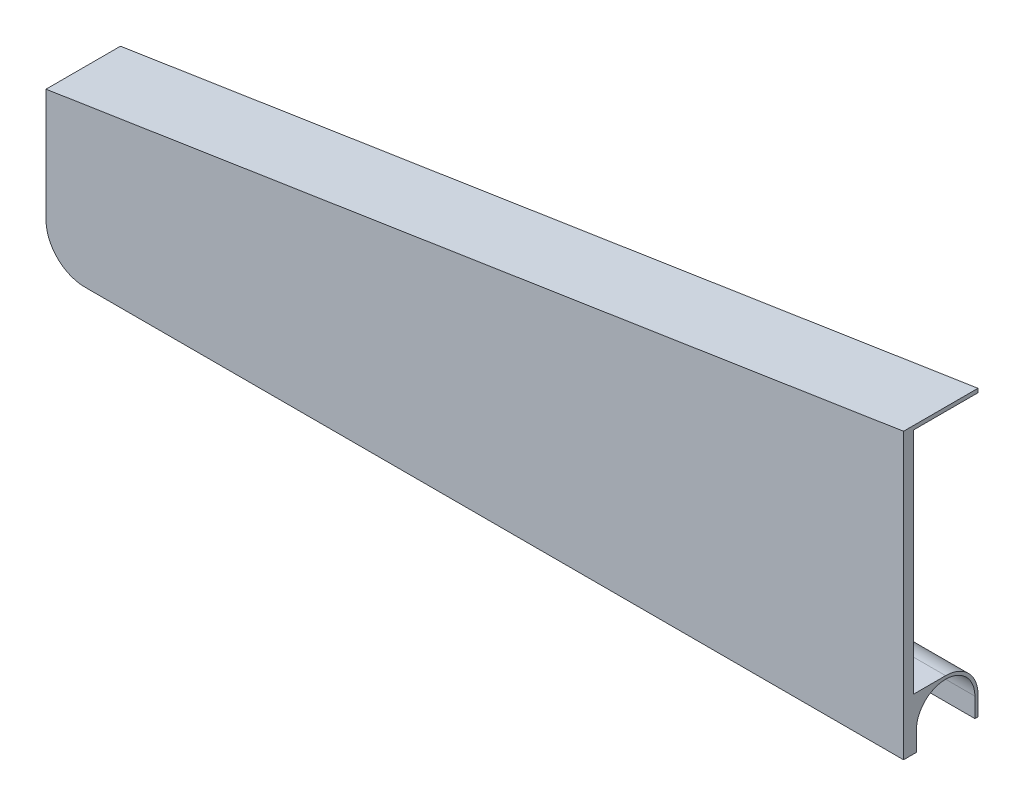
ISO-10303-21;
HEADER;
FILE_DESCRIPTION(('STEP AP214'),'2;1');
FILE_NAME('part.step','',(''),(''),'','','');
FILE_SCHEMA(('AUTOMOTIVE_DESIGN { 1 0 10303 214 1 1 1 1 }'));
ENDSEC;
DATA;
#1=APPLICATION_CONTEXT('core data for automotive mechanical design processes');
#2=APPLICATION_PROTOCOL_DEFINITION('international standard','automotive_design',2000,#1);
#3=PRODUCT_CONTEXT('',#1,'mechanical');
#4=PRODUCT('Part','Part','',(#3));
#5=PRODUCT_RELATED_PRODUCT_CATEGORY('part','',(#4));
#6=PRODUCT_DEFINITION_FORMATION('','',#4);
#7=PRODUCT_DEFINITION_CONTEXT('part definition',#1,'design');
#8=PRODUCT_DEFINITION('design','',#6,#7);
#9=PRODUCT_DEFINITION_SHAPE('','',#8);
#10=(LENGTH_UNIT() NAMED_UNIT(*) SI_UNIT(.MILLI.,.METRE.));
#11=(NAMED_UNIT(*) PLANE_ANGLE_UNIT() SI_UNIT($,.RADIAN.));
#12=(NAMED_UNIT(*) SI_UNIT($,.STERADIAN.) SOLID_ANGLE_UNIT());
#13=UNCERTAINTY_MEASURE_WITH_UNIT(LENGTH_MEASURE(1.E-05),#10,'distance_accuracy_value','');
#14=(GEOMETRIC_REPRESENTATION_CONTEXT(3) GLOBAL_UNCERTAINTY_ASSIGNED_CONTEXT((#13)) GLOBAL_UNIT_ASSIGNED_CONTEXT((#10,
#11,#12)) REPRESENTATION_CONTEXT('',''));
#15=CARTESIAN_POINT('',(0.,0.,0.));
#16=DIRECTION('',(0.,0.,1.));
#17=DIRECTION('',(1.,0.,0.));
#18=AXIS2_PLACEMENT_3D('',#15,#16,#17);
#19=CARTESIAN_POINT('',(0.,0.,0.));
#20=DIRECTION('',(0.,0.,1.));
#21=DIRECTION('',(1.,0.,0.));
#22=AXIS2_PLACEMENT_3D('',#19,#20,#21);
#23=PLANE('',#22);
#24=DIRECTION('',(-0.988267602905192,-0.15273226590353,0.));
#25=VECTOR('',#24,1.);
#26=CARTESIAN_POINT('',(50.7148891217656,-23.9579456620378,0.));
#27=LINE('',#26,#25);
#28=CARTESIAN_POINT('',(50.7148891217656,-23.9579456620378,0.));
#29=VERTEX_POINT('',#28);
#30=CARTESIAN_POINT('',(-508.085110878234,-110.317945662038,0.));
#31=VERTEX_POINT('',#30);
#32=EDGE_CURVE('E193',#29,#31,#27,.T.);
#33=ORIENTED_EDGE('',*,*,#32,.F.);
#34=DIRECTION('',(0.,-1.,0.));
#35=VECTOR('',#34,1.);
#36=CARTESIAN_POINT('',(50.7148891217656,0.,0.));
#37=LINE('',#36,#35);
#38=CARTESIAN_POINT('',(50.7148891217656,-173.055945662038,0.));
#39=VERTEX_POINT('',#38);
#40=EDGE_CURVE('E198',#29,#39,#37,.T.);
#41=ORIENTED_EDGE('',*,*,#40,.T.);
#42=DIRECTION('',(1.,0.,0.));
#43=VECTOR('',#42,1.);
#44=CARTESIAN_POINT('',(-508.085110878234,-173.055945662038,0.));
#45=LINE('',#44,#43);
#46=CARTESIAN_POINT('',(-508.085110878234,-173.055945662038,0.));
#47=VERTEX_POINT('',#46);
#48=EDGE_CURVE('E345',#47,#39,#45,.T.);
#49=ORIENTED_EDGE('',*,*,#48,.F.);
#50=DIRECTION('',(0.,-1.,0.));
#51=VECTOR('',#50,1.);
#52=CARTESIAN_POINT('',(-508.085110878234,0.,0.));
#53=LINE('',#52,#51);
#54=EDGE_CURVE('E343',#31,#47,#53,.T.);
#55=ORIENTED_EDGE('',*,*,#54,.F.);
#56=EDGE_LOOP('',(#33,#41,#49,#55));
#57=FACE_BOUND('',#56,.T.);
#58=ADVANCED_FACE('F68',(#57),#23,.F.);
#59=CARTESIAN_POINT('',(-508.085110878234,0.,6.35));
#60=DIRECTION('',(1.,0.,0.));
#61=DIRECTION('',(0.,0.,-1.));
#62=AXIS2_PLACEMENT_3D('',#59,#60,#61);
#63=PLANE('',#62);
#64=DIRECTION('',(0.,-1.,0.));
#65=VECTOR('',#64,1.);
#66=CARTESIAN_POINT('',(-508.085110878234,0.,6.35));
#67=LINE('',#66,#65);
#68=CARTESIAN_POINT('',(-508.085110878235,-107.777945662038,6.35));
#69=VERTEX_POINT('',#68);
#70=CARTESIAN_POINT('',(-508.085110878234,-181.437945662038,6.35));
#71=VERTEX_POINT('',#70);
#72=EDGE_CURVE('E334',#69,#71,#67,.T.);
#73=ORIENTED_EDGE('',*,*,#72,.F.);
#74=DIRECTION('',(0.,0.,-1.));
#75=VECTOR('',#74,1.);
#76=CARTESIAN_POINT('',(-508.085110878235,-107.777945662038,93.726));
#77=LINE('',#76,#75);
#78=CARTESIAN_POINT('',(-508.085110878234,-107.777945662038,-42.164));
#79=VERTEX_POINT('',#78);
#80=EDGE_CURVE('E82',#69,#79,#77,.T.);
#81=ORIENTED_EDGE('',*,*,#80,.T.);
#82=DIRECTION('',(0.,1.,0.));
#83=VECTOR('',#82,1.);
#84=CARTESIAN_POINT('',(-508.085110878234,-107.777945662038,-42.164));
#85=LINE('',#84,#83);
#86=CARTESIAN_POINT('',(-508.085110878234,-110.317945662038,-42.164));
#87=VERTEX_POINT('',#86);
#88=EDGE_CURVE('E184',#87,#79,#85,.T.);
#89=ORIENTED_EDGE('',*,*,#88,.F.);
#90=DIRECTION('',(0.,0.,1.));
#91=VECTOR('',#90,1.);
#92=CARTESIAN_POINT('',(-508.085110878234,-110.317945662038,-42.164));
#93=LINE('',#92,#91);
#94=EDGE_CURVE('E180',#87,#31,#93,.T.);
#95=ORIENTED_EDGE('',*,*,#94,.T.);
#96=ORIENTED_EDGE('',*,*,#54,.T.);
#97=DIRECTION('',(0.,0.,1.));
#98=VECTOR('',#97,1.);
#99=CARTESIAN_POINT('',(-508.085110878234,-173.055945662038,0.));
#100=LINE('',#99,#98);
#101=CARTESIAN_POINT('',(-508.085110878234,-173.055945662038,-21.082));
#102=VERTEX_POINT('',#101);
#103=EDGE_CURVE('E250',#102,#47,#100,.T.);
#104=ORIENTED_EDGE('',*,*,#103,.F.);
#105=CARTESIAN_POINT('',(-508.085110878234,-194.137945662038,-21.082));
#106=DIRECTION('',(-1.,0.,0.));
#107=DIRECTION('',(0.,-1.,0.));
#108=AXIS2_PLACEMENT_3D('',#105,#106,#107);
#109=CIRCLE('',#108,21.082);
#110=CARTESIAN_POINT('',(-508.085110878234,-181.437945662038,-37.9093801882527));
#111=VERTEX_POINT('',#110);
#112=EDGE_CURVE('E301',#102,#111,#109,.T.);
#113=ORIENTED_EDGE('',*,*,#112,.T.);
#114=DIRECTION('',(0.,0.,1.));
#115=VECTOR('',#114,1.);
#116=CARTESIAN_POINT('',(-508.085110878234,-181.437945662038,-93.726));
#117=LINE('',#116,#115);
#118=CARTESIAN_POINT('',(-508.085110878234,-181.437945662038,-35.2810316571236));
#119=VERTEX_POINT('',#118);
#120=EDGE_CURVE('E205',#111,#119,#117,.T.);
#121=ORIENTED_EDGE('',*,*,#120,.T.);
#122=CARTESIAN_POINT('',(-508.085110878234,-194.137945662038,-21.082));
#123=DIRECTION('',(-1.,0.,0.));
#124=DIRECTION('',(0.,-1.,0.));
#125=AXIS2_PLACEMENT_3D('',#122,#123,#124);
#126=CIRCLE('',#125,19.05);
#127=CARTESIAN_POINT('',(-508.085110878234,-181.437945662038,-6.8829683428764));
#128=VERTEX_POINT('',#127);
#129=EDGE_CURVE('E296',#128,#119,#126,.T.);
#130=ORIENTED_EDGE('',*,*,#129,.F.);
#131=DIRECTION('',(0.,0.,-1.));
#132=VECTOR('',#131,1.);
#133=CARTESIAN_POINT('',(-508.085110878234,-181.437945662038,6.35));
#134=LINE('',#133,#132);
#135=EDGE_CURVE('E282',#71,#128,#134,.T.);
#136=ORIENTED_EDGE('',*,*,#135,.F.);
#137=EDGE_LOOP('',(#73,#81,#89,#95,#96,#104,#113,#121,#130,#136));
#138=FACE_BOUND('',#137,.T.);
#139=ADVANCED_FACE('F70',(#138),#63,.F.);
#140=CARTESIAN_POINT('',(-508.085110878234,-206.837945662038,-40.132));
#141=DIRECTION('',(0.,-1.,0.));
#142=DIRECTION('',(1.,0.,0.));
#143=AXIS2_PLACEMENT_3D('',#140,#141,#142);
#144=PLANE('',#143);
#145=DIRECTION('',(1.,0.,0.));
#146=VECTOR('',#145,1.);
#147=CARTESIAN_POINT('',(-508.085110878234,-206.837945662038,-40.132));
#148=LINE('',#147,#146);
#149=CARTESIAN_POINT('',(-482.685110878234,-206.837945662038,-40.132));
#150=VERTEX_POINT('',#149);
#151=CARTESIAN_POINT('',(50.7148891217656,-206.837945662038,-40.132));
#152=VERTEX_POINT('',#151);
#153=EDGE_CURVE('E327',#150,#152,#148,.T.);
#154=ORIENTED_EDGE('',*,*,#153,.F.);
#155=DIRECTION('',(0.,0.,1.));
#156=VECTOR('',#155,1.);
#157=CARTESIAN_POINT('',(-482.685110878234,-206.837945662038,-93.726));
#158=LINE('',#157,#156);
#159=CARTESIAN_POINT('',(-482.685110878234,-206.837945662038,-42.164));
#160=VERTEX_POINT('',#159);
#161=EDGE_CURVE('E200',#160,#150,#158,.T.);
#162=ORIENTED_EDGE('',*,*,#161,.F.);
#163=DIRECTION('',(1.,0.,0.));
#164=VECTOR('',#163,1.);
#165=CARTESIAN_POINT('',(-508.085110878234,-206.837945662038,-42.164));
#166=LINE('',#165,#164);
#167=CARTESIAN_POINT('',(50.7148891217656,-206.837945662038,-42.164));
#168=VERTEX_POINT('',#167);
#169=EDGE_CURVE('E329',#160,#168,#166,.T.);
#170=ORIENTED_EDGE('',*,*,#169,.T.);
#171=DIRECTION('',(0.,0.,-1.));
#172=VECTOR('',#171,1.);
#173=CARTESIAN_POINT('',(50.7148891217656,-206.837945662038,-40.132));
#174=LINE('',#173,#172);
#175=EDGE_CURVE('E313',#152,#168,#174,.T.);
#176=ORIENTED_EDGE('',*,*,#175,.F.);
#177=EDGE_LOOP('',(#154,#162,#170,#176));
#178=FACE_BOUND('',#177,.T.);
#179=ADVANCED_FACE('F274',(#178),#144,.T.);
#180=CARTESIAN_POINT('',(-482.685110878234,-181.437945662038,6.35));
#181=DIRECTION('',(0.,0.,-1.));
#182=DIRECTION('',(-1.,0.,0.));
#183=AXIS2_PLACEMENT_3D('',#180,#181,#182);
#184=CYLINDRICAL_SURFACE('',#183,25.4);
#185=ORIENTED_EDGE('',*,*,#135,.T.);
#186=CARTESIAN_POINT('',(-508.085110878234,-181.437945662038,-6.8829683428764));
#187=CARTESIAN_POINT('',(-508.085110853028,-181.60945252099,-6.72956719004997));
#188=CARTESIAN_POINT('',(-508.083373348191,-181.783723997483,-6.5792892611043));
#189=CARTESIAN_POINT('',(-508.076090964915,-182.137557457659,-6.28517186652555));
#190=CARTESIAN_POINT('',(-508.070545855066,-182.317119762261,-6.14133279278495));
#191=CARTESIAN_POINT('',(-508.047697829708,-182.863422146816,-5.71973595761478));
#192=CARTESIAN_POINT('',(-508.024181965592,-183.237712354122,-5.45195701163423));
#193=CARTESIAN_POINT('',(-507.958184168992,-184.002905967128,-4.94527906713364));
#194=CARTESIAN_POINT('',(-507.915731173468,-184.393783205462,-4.70633670986128));
#195=CARTESIAN_POINT('',(-507.809738556414,-185.189492229823,-4.25832427173176));
#196=CARTESIAN_POINT('',(-507.746202856225,-185.594321408278,-4.04924864605675));
#197=CARTESIAN_POINT('',(-507.596050115694,-186.415906139081,-3.66133084835671));
#198=CARTESIAN_POINT('',(-507.509350866137,-186.832699355812,-3.48260014194911));
#199=CARTESIAN_POINT('',(-507.31174018432,-187.67296092858,-3.15689089425396));
#200=CARTESIAN_POINT('',(-507.200825966186,-188.096430047457,-3.0099160102702));
#201=CARTESIAN_POINT('',(-506.954221881208,-188.945644371535,-2.74788454658425));
#202=CARTESIAN_POINT('',(-506.818551018047,-189.371387589415,-2.63280365393837));
#203=CARTESIAN_POINT('',(-506.522369820378,-190.221322496853,-2.43386000573012));
#204=CARTESIAN_POINT('',(-506.361865963714,-190.645514561583,-2.34998912821004));
#205=CARTESIAN_POINT('',(-505.97435007336,-191.591354382813,-2.19551981212751));
#206=CARTESIAN_POINT('',(-505.740653370124,-192.111643085528,-2.13309542331459));
#207=CARTESIAN_POINT('',(-505.36334297739,-192.880826831807,-2.07178099981974));
#208=CARTESIAN_POINT('',(-505.233166744518,-193.135251560675,-2.05672947116737));
#209=CARTESIAN_POINT('',(-504.964118338946,-193.639894845376,-2.03683889631536));
#210=CARTESIAN_POINT('',(-504.825245525546,-193.890113089577,-2.03200060346716));
#211=CARTESIAN_POINT('',(-504.682156134359,-194.137945662038,-2.032));
#212=B_SPLINE_CURVE_WITH_KNOTS('',3,(#186,#187,#188,#189,#190,#191,#192,#193,#194,#195,#196,
#197,#198,#199,#200,#201,#202,#203,#204,#205,#206,#207,#208,#209,#210,#211),.UNSPECIFIED.,.F.,
.F.,(4,2,2,2,2,2,2,2,2,2,2,2,4),(0.,0.690212979654413,1.38046791125708,2.76123998176141,
4.13990934730638,5.51832242658451,6.90169412584391,8.28522506257535,9.66769840772433,
11.0498117320456,12.7676853661981,13.6259672320179,14.4843124044433),.UNSPECIFIED.);
#213=CARTESIAN_POINT('',(-504.682156134359,-194.137945662038,-2.03199999999999));
#214=VERTEX_POINT('',#213);
#215=EDGE_CURVE('E208',#128,#214,#212,.T.);
#216=ORIENTED_EDGE('',*,*,#215,.T.);
#217=CARTESIAN_POINT('',(-482.685110878234,-181.437945662038,-2.03199999999999));
#218=DIRECTION('',(0.,0.,-1.));
#219=DIRECTION('',(0.,1.,0.));
#220=AXIS2_PLACEMENT_3D('',#217,#218,#219);
#221=CIRCLE('',#220,25.4);
#222=CARTESIAN_POINT('',(-482.685110878234,-206.837945662038,-2.03199999999999));
#223=VERTEX_POINT('',#222);
#224=EDGE_CURVE('E76',#214,#223,#221,.F.);
#225=ORIENTED_EDGE('',*,*,#224,.T.);
#226=DIRECTION('',(0.,0.,-1.));
#227=VECTOR('',#226,1.);
#228=CARTESIAN_POINT('',(-482.685110878234,-206.837945662038,6.35));
#229=LINE('',#228,#227);
#230=CARTESIAN_POINT('',(-482.685110878234,-206.837945662038,6.35));
#231=VERTEX_POINT('',#230);
#232=EDGE_CURVE('E291',#231,#223,#229,.T.);
#233=ORIENTED_EDGE('',*,*,#232,.F.);
#234=CARTESIAN_POINT('',(-482.685110878234,-181.437945662038,6.35));
#235=DIRECTION('',(0.,0.,1.));
#236=DIRECTION('',(1.,0.,0.));
#237=AXIS2_PLACEMENT_3D('',#234,#235,#236);
#238=CIRCLE('',#237,25.4);
#239=EDGE_CURVE('E287',#231,#71,#238,.F.);
#240=ORIENTED_EDGE('',*,*,#239,.T.);
#241=EDGE_LOOP('',(#185,#216,#225,#233,#240));
#242=FACE_BOUND('',#241,.T.);
#243=ADVANCED_FACE('F271',(#242),#184,.T.);
#244=CARTESIAN_POINT('',(0.,-206.837945662038,6.35));
#245=DIRECTION('',(0.,1.,0.));
#246=DIRECTION('',(-1.,0.,0.));
#247=AXIS2_PLACEMENT_3D('',#244,#245,#246);
#248=PLANE('',#247);
#249=ORIENTED_EDGE('',*,*,#232,.T.);
#250=DIRECTION('',(1.,0.,0.));
#251=VECTOR('',#250,1.);
#252=CARTESIAN_POINT('',(-508.085110878234,-206.837945662038,-2.032));
#253=LINE('',#252,#251);
#254=CARTESIAN_POINT('',(50.7148891217656,-206.837945662038,-2.032));
#255=VERTEX_POINT('',#254);
#256=EDGE_CURVE('E300',#223,#255,#253,.T.);
#257=ORIENTED_EDGE('',*,*,#256,.T.);
#258=DIRECTION('',(0.,0.,-1.));
#259=VECTOR('',#258,1.);
#260=CARTESIAN_POINT('',(50.7148891217656,-206.837945662038,6.35));
#261=LINE('',#260,#259);
#262=CARTESIAN_POINT('',(50.7148891217656,-206.837945662038,6.35));
#263=VERTEX_POINT('',#262);
#264=EDGE_CURVE('E348',#263,#255,#261,.T.);
#265=ORIENTED_EDGE('',*,*,#264,.F.);
#266=DIRECTION('',(1.,0.,0.));
#267=VECTOR('',#266,1.);
#268=CARTESIAN_POINT('',(0.,-206.837945662038,6.35));
#269=LINE('',#268,#267);
#270=EDGE_CURVE('E337',#231,#263,#269,.T.);
#271=ORIENTED_EDGE('',*,*,#270,.F.);
#272=EDGE_LOOP('',(#249,#257,#265,#271));
#273=FACE_BOUND('',#272,.T.);
#274=ADVANCED_FACE('F269',(#273),#248,.F.);
#275=CARTESIAN_POINT('',(50.7148891217656,0.,6.35));
#276=DIRECTION('',(1.,0.,0.));
#277=DIRECTION('',(0.,1.,0.));
#278=AXIS2_PLACEMENT_3D('',#275,#276,#277);
#279=PLANE('',#278);
#280=ORIENTED_EDGE('',*,*,#40,.F.);
#281=DIRECTION('',(0.,0.,1.));
#282=VECTOR('',#281,1.);
#283=CARTESIAN_POINT('',(50.7148891217656,-23.9579456620378,-42.164));
#284=LINE('',#283,#282);
#285=CARTESIAN_POINT('',(50.7148891217656,-23.9579456620378,-42.164));
#286=VERTEX_POINT('',#285);
#287=EDGE_CURVE('E177',#286,#29,#284,.T.);
#288=ORIENTED_EDGE('',*,*,#287,.F.);
#289=DIRECTION('',(0.,-1.,0.));
#290=VECTOR('',#289,1.);
#291=CARTESIAN_POINT('',(50.7148891217656,-21.4179456620378,-42.164));
#292=LINE('',#291,#290);
#293=CARTESIAN_POINT('',(50.7148891217656,-21.4179456620378,-42.164));
#294=VERTEX_POINT('',#293);
#295=EDGE_CURVE('E185',#294,#286,#292,.T.);
#296=ORIENTED_EDGE('',*,*,#295,.F.);
#297=DIRECTION('',(0.,0.,-1.));
#298=VECTOR('',#297,1.);
#299=CARTESIAN_POINT('',(50.7148891217656,-21.4179456620378,6.35));
#300=LINE('',#299,#298);
#301=CARTESIAN_POINT('',(50.7148891217656,-21.4179456620378,6.34999999999999));
#302=VERTEX_POINT('',#301);
#303=EDGE_CURVE('E342',#302,#294,#300,.T.);
#304=ORIENTED_EDGE('',*,*,#303,.F.);
#305=DIRECTION('',(0.,-1.,0.));
#306=VECTOR('',#305,1.);
#307=CARTESIAN_POINT('',(50.7148891217656,0.,6.35));
#308=LINE('',#307,#306);
#309=EDGE_CURVE('E339',#302,#263,#308,.T.);
#310=ORIENTED_EDGE('',*,*,#309,.T.);
#311=ORIENTED_EDGE('',*,*,#264,.T.);
#312=DIRECTION('',(0.,1.,0.));
#313=VECTOR('',#312,1.);
#314=CARTESIAN_POINT('',(50.7148891217656,-206.837945662038,-2.032));
#315=LINE('',#314,#313);
#316=CARTESIAN_POINT('',(50.7148891217656,-194.137945662038,-2.032));
#317=VERTEX_POINT('',#316);
#318=EDGE_CURVE('E304',#255,#317,#315,.T.);
#319=ORIENTED_EDGE('',*,*,#318,.T.);
#320=CARTESIAN_POINT('',(50.7148891217656,-194.137945662038,-21.082));
#321=DIRECTION('',(-1.,0.,0.));
#322=DIRECTION('',(0.,-1.,0.));
#323=AXIS2_PLACEMENT_3D('',#320,#321,#322);
#324=CIRCLE('',#323,19.05);
#325=CARTESIAN_POINT('',(50.7148891217656,-194.137945662038,-40.132));
#326=VERTEX_POINT('',#325);
#327=EDGE_CURVE('E319',#317,#326,#324,.T.);
#328=ORIENTED_EDGE('',*,*,#327,.T.);
#329=DIRECTION('',(0.,1.,0.));
#330=VECTOR('',#329,1.);
#331=CARTESIAN_POINT('',(50.7148891217656,-206.837945662038,-40.132));
#332=LINE('',#331,#330);
#333=EDGE_CURVE('E316',#152,#326,#332,.T.);
#334=ORIENTED_EDGE('',*,*,#333,.F.);
#335=ORIENTED_EDGE('',*,*,#175,.T.);
#336=DIRECTION('',(0.,1.,0.));
#337=VECTOR('',#336,1.);
#338=CARTESIAN_POINT('',(50.7148891217656,-206.837945662038,-42.164));
#339=LINE('',#338,#337);
#340=CARTESIAN_POINT('',(50.7148891217656,-194.137945662038,-42.164));
#341=VERTEX_POINT('',#340);
#342=EDGE_CURVE('E310',#168,#341,#339,.T.);
#343=ORIENTED_EDGE('',*,*,#342,.T.);
#344=CARTESIAN_POINT('',(50.7148891217656,-194.137945662038,-21.082));
#345=DIRECTION('',(-1.,0.,0.));
#346=DIRECTION('',(0.,-1.,0.));
#347=AXIS2_PLACEMENT_3D('',#344,#345,#346);
#348=CIRCLE('',#347,21.082);
#349=CARTESIAN_POINT('',(50.7148891217656,-173.055945662038,-21.082));
#350=VERTEX_POINT('',#349);
#351=EDGE_CURVE('E248',#350,#341,#348,.T.);
#352=ORIENTED_EDGE('',*,*,#351,.F.);
#353=DIRECTION('',(0.,0.,1.));
#354=VECTOR('',#353,1.);
#355=CARTESIAN_POINT('',(50.7148891217656,-173.055945662038,0.));
#356=LINE('',#355,#354);
#357=EDGE_CURVE('E333',#350,#39,#356,.T.);
#358=ORIENTED_EDGE('',*,*,#357,.T.);
#359=EDGE_LOOP('',(#280,#288,#296,#304,#310,#311,#319,#328,#334,#335,#343,#352,#358));
#360=FACE_BOUND('',#359,.T.);
#361=ADVANCED_FACE('F196',(#360),#279,.T.);
#362=CARTESIAN_POINT('',(0.,0.,6.35));
#363=DIRECTION('',(0.,0.,1.));
#364=DIRECTION('',(1.,0.,0.));
#365=AXIS2_PLACEMENT_3D('',#362,#363,#364);
#366=PLANE('',#365);
#367=DIRECTION('',(0.988267602905192,0.15273226590353,0.));
#368=VECTOR('',#367,1.);
#369=CARTESIAN_POINT('',(4.41586579580281,-28.5732492669593,6.35));
#370=LINE('',#369,#368);
#371=EDGE_CURVE('E12',#69,#302,#370,.T.);
#372=ORIENTED_EDGE('',*,*,#371,.F.);
#373=ORIENTED_EDGE('',*,*,#72,.T.);
#374=ORIENTED_EDGE('',*,*,#239,.F.);
#375=ORIENTED_EDGE('',*,*,#270,.T.);
#376=ORIENTED_EDGE('',*,*,#309,.F.);
#377=EDGE_LOOP('',(#372,#373,#374,#375,#376));
#378=FACE_BOUND('',#377,.T.);
#379=ADVANCED_FACE('F260',(#378),#366,.T.);
#380=CARTESIAN_POINT('',(-508.085110878234,-173.055945662038,0.));
#381=DIRECTION('',(0.,1.,0.));
#382=DIRECTION('',(-1.,0.,0.));
#383=AXIS2_PLACEMENT_3D('',#380,#381,#382);
#384=PLANE('',#383);
#385=ORIENTED_EDGE('',*,*,#357,.F.);
#386=DIRECTION('',(1.,0.,0.));
#387=VECTOR('',#386,1.);
#388=CARTESIAN_POINT('',(-508.085110878234,-173.055945662038,-21.082));
#389=LINE('',#388,#387);
#390=EDGE_CURVE('E366',#102,#350,#389,.T.);
#391=ORIENTED_EDGE('',*,*,#390,.F.);
#392=ORIENTED_EDGE('',*,*,#103,.T.);
#393=ORIENTED_EDGE('',*,*,#48,.T.);
#394=EDGE_LOOP('',(#385,#391,#392,#393));
#395=FACE_BOUND('',#394,.T.);
#396=ADVANCED_FACE('F235',(#395),#384,.T.);
#397=CARTESIAN_POINT('',(-508.085110878234,-194.137945662038,-21.082));
#398=DIRECTION('',(1.,0.,0.));
#399=DIRECTION('',(0.,1.,0.));
#400=AXIS2_PLACEMENT_3D('',#397,#398,#399);
#401=CYLINDRICAL_SURFACE('',#400,21.082);
#402=DIRECTION('',(1.,0.,0.));
#403=VECTOR('',#402,1.);
#404=CARTESIAN_POINT('',(-508.085110878234,-194.137945662038,-42.164));
#405=LINE('',#404,#403);
#406=CARTESIAN_POINT('',(-504.682156134359,-194.137945662038,-42.164));
#407=VERTEX_POINT('',#406);
#408=EDGE_CURVE('E331',#407,#341,#405,.T.);
#409=ORIENTED_EDGE('',*,*,#408,.F.);
#410=CARTESIAN_POINT('',(-504.682156134359,-194.137945662038,-42.164));
#411=CARTESIAN_POINT('',(-504.804079511075,-193.926771679975,-42.164000602156));
#412=CARTESIAN_POINT('',(-504.922947732922,-193.713857716975,-42.1608262355632));
#413=CARTESIAN_POINT('',(-505.15443521038,-193.284838970804,-42.1478254994366));
#414=CARTESIAN_POINT('',(-505.267053966068,-193.068733934111,-42.1379985985649));
#415=CARTESIAN_POINT('',(-505.595349578127,-192.416017514296,-42.0980805608319));
#416=CARTESIAN_POINT('',(-505.801409847549,-191.97510174069,-42.0575518115801));
#417=CARTESIAN_POINT('',(-506.186402094067,-191.085939707505,-41.9467187062815));
#418=CARTESIAN_POINT('',(-506.365368165951,-190.637703460606,-41.8764522016643));
#419=CARTESIAN_POINT('',(-506.695790490208,-189.737174624662,-41.7046564115015));
#420=CARTESIAN_POINT('',(-506.847252701955,-189.284882936666,-41.6031339112009));
#421=CARTESIAN_POINT('',(-507.123005501167,-188.378721531452,-41.3675109659253));
#422=CARTESIAN_POINT('',(-507.247202620987,-187.924851642267,-41.2333016836233));
#423=CARTESIAN_POINT('',(-507.468236818338,-187.021229897444,-40.9321866276359));
#424=CARTESIAN_POINT('',(-507.565069437984,-186.571478724309,-40.7652755340684));
#425=CARTESIAN_POINT('',(-507.732317023376,-185.680884471124,-40.3993583405849));
#426=CARTESIAN_POINT('',(-507.802764257429,-185.240031138066,-40.2003918720722));
#427=CARTESIAN_POINT('',(-507.919043649911,-184.370678083253,-39.7711982797994));
#428=CARTESIAN_POINT('',(-507.964884996162,-183.942173807006,-39.5409828646622));
#429=CARTESIAN_POINT('',(-508.029159627432,-183.16127344269,-39.0858119058098));
#430=CARTESIAN_POINT('',(-508.05058277561,-182.806782273241,-38.8648455655925));
#431=CARTESIAN_POINT('',(-508.07855851208,-182.111677867964,-38.4023352542931));
#432=CARTESIAN_POINT('',(-508.085134557369,-181.771043577031,-38.1608243690366));
#433=CARTESIAN_POINT('',(-508.085110878234,-181.437945662038,-37.9093801882527));
#434=B_SPLINE_CURVE_WITH_KNOTS('',3,(#410,#411,#412,#413,#414,#415,#416,#417,#418,#419,#420,
#421,#422,#423,#424,#425,#426,#427,#428,#429,#430,#431,#432,#433),.UNSPECIFIED.,.F.,.F.,(4,2,2,
2,2,2,2,2,2,2,2,4),(0.,0.731439216416698,1.46293685976263,2.92626687415608,4.3877398777651,
5.84889583920832,7.314985179784,8.78131321993101,10.2458420962784,11.7098237373928,
12.9636435827922,14.2154811229653),.UNSPECIFIED.);
#435=EDGE_CURVE('E239',#407,#111,#434,.T.);
#436=ORIENTED_EDGE('',*,*,#435,.T.);
#437=ORIENTED_EDGE('',*,*,#112,.F.);
#438=ORIENTED_EDGE('',*,*,#390,.T.);
#439=ORIENTED_EDGE('',*,*,#351,.T.);
#440=EDGE_LOOP('',(#409,#436,#437,#438,#439));
#441=FACE_BOUND('',#440,.T.);
#442=ADVANCED_FACE('F252',(#441),#401,.T.);
#443=CARTESIAN_POINT('',(-508.085110878234,-206.837945662038,-42.164));
#444=DIRECTION('',(0.,0.,-1.));
#445=DIRECTION('',(-1.,0.,0.));
#446=AXIS2_PLACEMENT_3D('',#443,#444,#445);
#447=PLANE('',#446);
#448=CARTESIAN_POINT('',(-482.685110878234,-181.437945662038,-42.164));
#449=DIRECTION('',(0.,0.,-1.));
#450=DIRECTION('',(-1.,0.,0.));
#451=AXIS2_PLACEMENT_3D('',#448,#449,#450);
#452=CIRCLE('',#451,25.4);
#453=EDGE_CURVE('E249',#407,#160,#452,.F.);
#454=ORIENTED_EDGE('',*,*,#453,.F.);
#455=ORIENTED_EDGE('',*,*,#408,.T.);
#456=ORIENTED_EDGE('',*,*,#342,.F.);
#457=ORIENTED_EDGE('',*,*,#169,.F.);
#458=EDGE_LOOP('',(#454,#455,#456,#457));
#459=FACE_BOUND('',#458,.T.);
#460=ADVANCED_FACE('F257',(#459),#447,.T.);
#461=CARTESIAN_POINT('',(-508.085110878234,-206.837945662038,-40.132));
#462=DIRECTION('',(0.,0.,-1.));
#463=DIRECTION('',(-1.,0.,0.));
#464=AXIS2_PLACEMENT_3D('',#461,#462,#463);
#465=PLANE('',#464);
#466=DIRECTION('',(1.,0.,0.));
#467=VECTOR('',#466,1.);
#468=CARTESIAN_POINT('',(-508.085110878234,-194.137945662038,-40.132));
#469=LINE('',#468,#467);
#470=CARTESIAN_POINT('',(-504.682156134359,-194.137945662038,-40.132));
#471=VERTEX_POINT('',#470);
#472=EDGE_CURVE('E325',#471,#326,#469,.T.);
#473=ORIENTED_EDGE('',*,*,#472,.F.);
#474=CARTESIAN_POINT('',(-482.685110878234,-181.437945662038,-40.132));
#475=DIRECTION('',(0.,0.,-1.));
#476=DIRECTION('',(-1.,0.,0.));
#477=AXIS2_PLACEMENT_3D('',#474,#475,#476);
#478=CIRCLE('',#477,25.4);
#479=EDGE_CURVE('E90',#471,#150,#478,.F.);
#480=ORIENTED_EDGE('',*,*,#479,.T.);
#481=ORIENTED_EDGE('',*,*,#153,.T.);
#482=ORIENTED_EDGE('',*,*,#333,.T.);
#483=EDGE_LOOP('',(#473,#480,#481,#482));
#484=FACE_BOUND('',#483,.T.);
#485=ADVANCED_FACE('F379',(#484),#465,.F.);
#486=CARTESIAN_POINT('',(-508.085110878234,-194.137945662038,-21.082));
#487=DIRECTION('',(1.,0.,0.));
#488=DIRECTION('',(0.,1.,0.));
#489=AXIS2_PLACEMENT_3D('',#486,#487,#488);
#490=CYLINDRICAL_SURFACE('',#489,19.05);
#491=CARTESIAN_POINT('',(-504.682156134359,-194.137945662038,-40.132));
#492=CARTESIAN_POINT('',(-504.79720975601,-193.938670363744,-40.1320003909494));
#493=CARTESIAN_POINT('',(-504.909542266543,-193.737845939561,-40.1288723911015));
#494=CARTESIAN_POINT('',(-505.128637186274,-193.333366321374,-40.1160775492312));
#495=CARTESIAN_POINT('',(-505.235399127924,-193.129710891571,-40.1064101592952));
#496=CARTESIAN_POINT('',(-505.54716362878,-192.514842149194,-40.0671696164448));
#497=CARTESIAN_POINT('',(-505.743584211063,-192.099831482841,-40.0273577929021));
#498=CARTESIAN_POINT('',(-506.112042738039,-191.263790426877,-39.9186433410634));
#499=CARTESIAN_POINT('',(-506.284124434883,-190.842772376236,-39.8497938224847));
#500=CARTESIAN_POINT('',(-506.603660878553,-189.997560315258,-39.6816046404365));
#501=CARTESIAN_POINT('',(-506.751120951007,-189.573367012519,-39.582271583745));
#502=CARTESIAN_POINT('',(-507.021774223212,-188.723977190887,-39.351805925321));
#503=CARTESIAN_POINT('',(-507.144873455938,-188.29878295229,-39.2205543800371));
#504=CARTESIAN_POINT('',(-507.366489919966,-187.452985054512,-38.9261683510065));
#505=CARTESIAN_POINT('',(-507.465003849174,-187.03238201923,-38.7630295896747));
#506=CARTESIAN_POINT('',(-507.638319030903,-186.200084642028,-38.4053326321614));
#507=CARTESIAN_POINT('',(-507.713136225676,-185.788384485069,-38.2107956930434));
#508=CARTESIAN_POINT('',(-507.840627117345,-184.977510247968,-37.7912009871163));
#509=CARTESIAN_POINT('',(-507.893306564792,-184.578332939824,-37.5661511665165));
#510=CARTESIAN_POINT('',(-507.988863951516,-183.700528957711,-37.0284070370652));
#511=CARTESIAN_POINT('',(-508.026251273516,-183.226161227395,-36.7077029691617));
#512=CARTESIAN_POINT('',(-508.062339033711,-182.537588191789,-36.195442838355));
#513=CARTESIAN_POINT('',(-508.071036658041,-182.311989671167,-36.0195746762521));
#514=CARTESIAN_POINT('',(-508.082422361592,-181.868820448773,-35.6577623386451));
#515=CARTESIAN_POINT('',(-508.085109770817,-181.651250644672,-35.4718170421453));
#516=CARTESIAN_POINT('',(-508.085110878234,-181.437945662038,-35.2810316571236));
#517=B_SPLINE_CURVE_WITH_KNOTS('',3,(#491,#492,#493,#494,#495,#496,#497,#498,#499,#500,#501,
#502,#503,#504,#505,#506,#507,#508,#509,#510,#511,#512,#513,#514,#515,#516),.UNSPECIFIED.,.F.,
.F.,(4,2,2,2,2,2,2,2,2,2,2,2,4),(0.,0.690227917147244,1.38051367334319,2.76144818206338,
4.13986785108379,5.51798898229213,6.90132653906521,8.2848497944102,9.66744028159056,
11.0496714016421,12.7677137040457,13.6259651289362,14.4843122237778),.UNSPECIFIED.);
#518=EDGE_CURVE('E217',#471,#119,#517,.T.);
#519=ORIENTED_EDGE('',*,*,#518,.F.);
#520=ORIENTED_EDGE('',*,*,#472,.T.);
#521=ORIENTED_EDGE('',*,*,#327,.F.);
#522=DIRECTION('',(1.,0.,0.));
#523=VECTOR('',#522,1.);
#524=CARTESIAN_POINT('',(-508.085110878234,-194.137945662038,-2.032));
#525=LINE('',#524,#523);
#526=EDGE_CURVE('E298',#214,#317,#525,.T.);
#527=ORIENTED_EDGE('',*,*,#526,.F.);
#528=ORIENTED_EDGE('',*,*,#215,.F.);
#529=ORIENTED_EDGE('',*,*,#129,.T.);
#530=EDGE_LOOP('',(#519,#520,#521,#527,#528,#529));
#531=FACE_BOUND('',#530,.T.);
#532=ADVANCED_FACE('F223',(#531),#490,.F.);
#533=CARTESIAN_POINT('',(-508.085110878234,-206.837945662038,-2.032));
#534=DIRECTION('',(0.,0.,-1.));
#535=DIRECTION('',(0.,1.,0.));
#536=AXIS2_PLACEMENT_3D('',#533,#534,#535);
#537=PLANE('',#536);
#538=ORIENTED_EDGE('',*,*,#224,.F.);
#539=ORIENTED_EDGE('',*,*,#526,.T.);
#540=ORIENTED_EDGE('',*,*,#318,.F.);
#541=ORIENTED_EDGE('',*,*,#256,.F.);
#542=EDGE_LOOP('',(#538,#539,#540,#541));
#543=FACE_BOUND('',#542,.T.);
#544=ADVANCED_FACE('F233',(#543),#537,.T.);
#545=CARTESIAN_POINT('',(-482.685110878234,-181.437945662038,-93.726));
#546=DIRECTION('',(0.,0.,1.));
#547=DIRECTION('',(1.,0.,0.));
#548=AXIS2_PLACEMENT_3D('',#545,#546,#547);
#549=CYLINDRICAL_SURFACE('',#548,25.4);
#550=ORIENTED_EDGE('',*,*,#453,.T.);
#551=ORIENTED_EDGE('',*,*,#161,.T.);
#552=ORIENTED_EDGE('',*,*,#479,.F.);
#553=ORIENTED_EDGE('',*,*,#518,.T.);
#554=ORIENTED_EDGE('',*,*,#120,.F.);
#555=ORIENTED_EDGE('',*,*,#435,.F.);
#556=EDGE_LOOP('',(#550,#551,#552,#553,#554,#555));
#557=FACE_BOUND('',#556,.T.);
#558=ADVANCED_FACE('F227',(#557),#549,.T.);
#559=CARTESIAN_POINT('',(4.41586579580281,-28.5732492669593,93.726));
#560=DIRECTION('',(0.15273226590353,-0.988267602905192,0.));
#561=DIRECTION('',(0.988267602905192,0.15273226590353,0.));
#562=AXIS2_PLACEMENT_3D('',#559,#560,#561);
#563=PLANE('',#562);
#564=ORIENTED_EDGE('',*,*,#371,.T.);
#565=ORIENTED_EDGE('',*,*,#303,.T.);
#566=DIRECTION('',(0.988267602905192,0.15273226590353,0.));
#567=VECTOR('',#566,1.);
#568=CARTESIAN_POINT('',(50.7148891217656,-21.4179456620378,-42.164));
#569=LINE('',#568,#567);
#570=EDGE_CURVE('E190',#79,#294,#569,.T.);
#571=ORIENTED_EDGE('',*,*,#570,.F.);
#572=ORIENTED_EDGE('',*,*,#80,.F.);
#573=EDGE_LOOP('',(#564,#565,#571,#572));
#574=FACE_BOUND('',#573,.T.);
#575=ADVANCED_FACE('F232',(#574),#563,.F.);
#576=CARTESIAN_POINT('',(50.7148891217656,-23.9579456620378,-42.164));
#577=DIRECTION('',(-0.15273226590353,0.988267602905192,0.));
#578=DIRECTION('',(-0.988267602905192,-0.15273226590353,0.));
#579=AXIS2_PLACEMENT_3D('',#576,#577,#578);
#580=PLANE('',#579);
#581=ORIENTED_EDGE('',*,*,#32,.T.);
#582=ORIENTED_EDGE('',*,*,#94,.F.);
#583=DIRECTION('',(-0.988267602905192,-0.15273226590353,0.));
#584=VECTOR('',#583,1.);
#585=CARTESIAN_POINT('',(50.7148891217656,-23.9579456620378,-42.164));
#586=LINE('',#585,#584);
#587=EDGE_CURVE('E173',#286,#87,#586,.T.);
#588=ORIENTED_EDGE('',*,*,#587,.F.);
#589=ORIENTED_EDGE('',*,*,#287,.T.);
#590=EDGE_LOOP('',(#581,#582,#588,#589));
#591=FACE_BOUND('',#590,.T.);
#592=ADVANCED_FACE('F175',(#591),#580,.F.);
#593=CARTESIAN_POINT('',(0.,0.,-42.164));
#594=DIRECTION('',(0.,0.,-1.));
#595=DIRECTION('',(-1.,0.,0.));
#596=AXIS2_PLACEMENT_3D('',#593,#594,#595);
#597=PLANE('',#596);
#598=ORIENTED_EDGE('',*,*,#295,.T.);
#599=ORIENTED_EDGE('',*,*,#587,.T.);
#600=ORIENTED_EDGE('',*,*,#88,.T.);
#601=ORIENTED_EDGE('',*,*,#570,.T.);
#602=EDGE_LOOP('',(#598,#599,#600,#601));
#603=FACE_BOUND('',#602,.T.);
#604=ADVANCED_FACE('F189',(#603),#597,.T.);
#605=CLOSED_SHELL('',(#58,#139,#179,#243,#274,#361,#379,#396,#442,#460,#485,#532,#544,#558,#575,
#592,#604));
#606=MANIFOLD_SOLID_BREP('B2',#605);
#607=ADVANCED_BREP_SHAPE_REPRESENTATION('',(#18,#606),#14);
#608=SHAPE_DEFINITION_REPRESENTATION(#9,#607);
ENDSEC;
END-ISO-10303-21;
